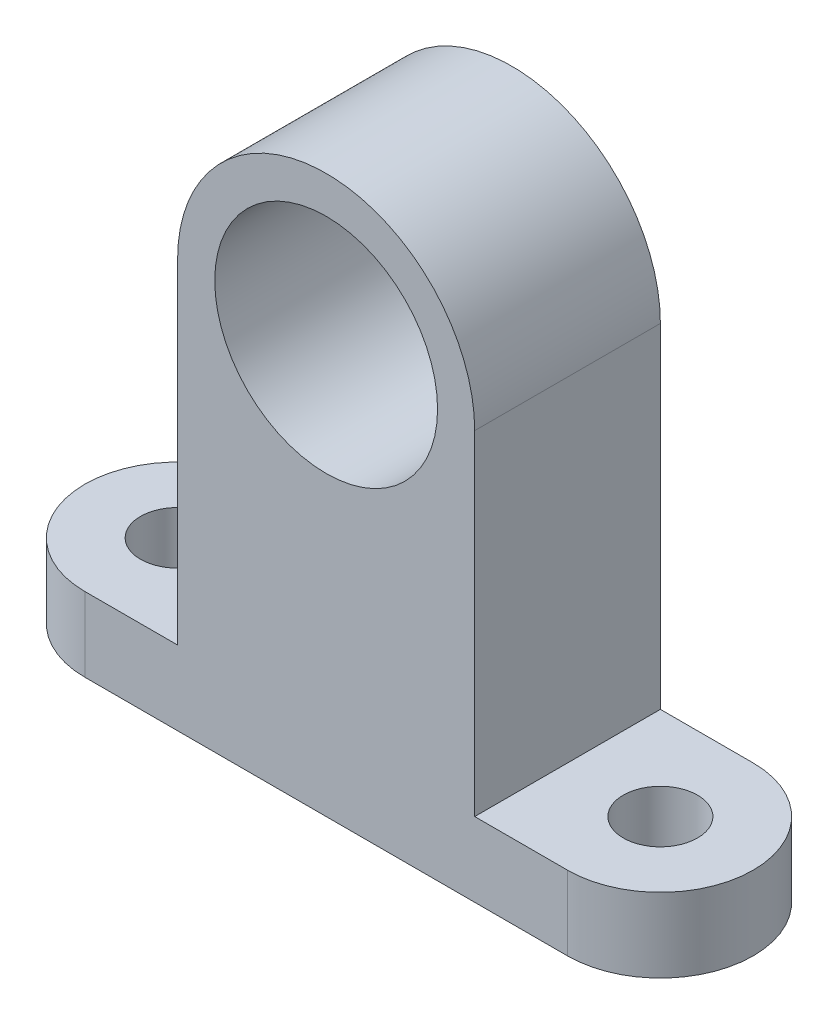
ISO-10303-21;
HEADER;
FILE_DESCRIPTION(('STEP AP214'),'2;1');
FILE_NAME('part.step','',(''),(''),'','','');
FILE_SCHEMA(('AUTOMOTIVE_DESIGN { 1 0 10303 214 1 1 1 1 }'));
ENDSEC;
DATA;
#1=APPLICATION_CONTEXT('core data for automotive mechanical design processes');
#2=APPLICATION_PROTOCOL_DEFINITION('international standard','automotive_design',2000,#1);
#3=PRODUCT_CONTEXT('',#1,'mechanical');
#4=PRODUCT('Part','Part','',(#3));
#5=PRODUCT_RELATED_PRODUCT_CATEGORY('part','',(#4));
#6=PRODUCT_DEFINITION_FORMATION('','',#4);
#7=PRODUCT_DEFINITION_CONTEXT('part definition',#1,'design');
#8=PRODUCT_DEFINITION('design','',#6,#7);
#9=PRODUCT_DEFINITION_SHAPE('','',#8);
#10=(LENGTH_UNIT() NAMED_UNIT(*) SI_UNIT(.MILLI.,.METRE.));
#11=(NAMED_UNIT(*) PLANE_ANGLE_UNIT() SI_UNIT($,.RADIAN.));
#12=(NAMED_UNIT(*) SI_UNIT($,.STERADIAN.) SOLID_ANGLE_UNIT());
#13=UNCERTAINTY_MEASURE_WITH_UNIT(LENGTH_MEASURE(1.E-05),#10,'distance_accuracy_value','');
#14=(GEOMETRIC_REPRESENTATION_CONTEXT(3) GLOBAL_UNCERTAINTY_ASSIGNED_CONTEXT((#13)) GLOBAL_UNIT_ASSIGNED_CONTEXT((#10,
#11,#12)) REPRESENTATION_CONTEXT('',''));
#15=CARTESIAN_POINT('',(0.,0.,0.));
#16=DIRECTION('',(0.,0.,1.));
#17=DIRECTION('',(1.,0.,0.));
#18=AXIS2_PLACEMENT_3D('',#15,#16,#17);
#19=CARTESIAN_POINT('',(0.,0.,127.));
#20=DIRECTION('',(0.,0.,1.));
#21=DIRECTION('',(1.,0.,0.));
#22=AXIS2_PLACEMENT_3D('',#19,#20,#21);
#23=PLANE('',#22);
#24=CARTESIAN_POINT('',(0.,0.,127.));
#25=DIRECTION('',(0.,0.,1.));
#26=DIRECTION('',(1.,0.,0.));
#27=AXIS2_PLACEMENT_3D('',#24,#25,#26);
#28=CIRCLE('',#27,203.2);
#29=CARTESIAN_POINT('',(203.2,0.,127.));
#30=VERTEX_POINT('',#29);
#31=CARTESIAN_POINT('',(-203.2,0.,127.));
#32=VERTEX_POINT('',#31);
#33=EDGE_CURVE('E162',#30,#32,#28,.T.);
#34=ORIENTED_EDGE('',*,*,#33,.T.);
#35=DIRECTION('',(0.,-1.,0.));
#36=VECTOR('',#35,1.);
#37=CARTESIAN_POINT('',(-203.2,0.,127.));
#38=LINE('',#37,#36);
#39=CARTESIAN_POINT('',(-203.2,-457.2,127.));
#40=VERTEX_POINT('',#39);
#41=EDGE_CURVE('E78',#32,#40,#38,.T.);
#42=ORIENTED_EDGE('',*,*,#41,.T.);
#43=DIRECTION('',(-1.,0.,0.));
#44=VECTOR('',#43,1.);
#45=CARTESIAN_POINT('',(-330.2,-457.2,127.));
#46=LINE('',#45,#44);
#47=CARTESIAN_POINT('',(-330.2,-457.2,127.));
#48=VERTEX_POINT('',#47);
#49=EDGE_CURVE('E124',#40,#48,#46,.T.);
#50=ORIENTED_EDGE('',*,*,#49,.T.);
#51=DIRECTION('',(0.,1.,0.));
#52=VECTOR('',#51,1.);
#53=CARTESIAN_POINT('',(-330.2,-558.8,127.));
#54=LINE('',#53,#52);
#55=CARTESIAN_POINT('',(-330.2,-558.8,127.));
#56=VERTEX_POINT('',#55);
#57=EDGE_CURVE('E121',#56,#48,#54,.T.);
#58=ORIENTED_EDGE('',*,*,#57,.F.);
#59=DIRECTION('',(-1.,0.,0.));
#60=VECTOR('',#59,1.);
#61=CARTESIAN_POINT('',(203.2,-558.8,127.));
#62=LINE('',#61,#60);
#63=CARTESIAN_POINT('',(330.2,-558.8,127.));
#64=VERTEX_POINT('',#63);
#65=EDGE_CURVE('E107',#64,#56,#62,.T.);
#66=ORIENTED_EDGE('',*,*,#65,.F.);
#67=DIRECTION('',(0.,1.,0.));
#68=VECTOR('',#67,1.);
#69=CARTESIAN_POINT('',(330.2,-558.8,127.));
#70=LINE('',#69,#68);
#71=CARTESIAN_POINT('',(330.2,-457.2,127.));
#72=VERTEX_POINT('',#71);
#73=EDGE_CURVE('E140',#64,#72,#70,.T.);
#74=ORIENTED_EDGE('',*,*,#73,.T.);
#75=CARTESIAN_POINT('',(203.2,-457.2,127.));
#76=VERTEX_POINT('',#75);
#77=EDGE_CURVE('E141',#72,#76,#46,.T.);
#78=ORIENTED_EDGE('',*,*,#77,.T.);
#79=DIRECTION('',(0.,1.,0.));
#80=VECTOR('',#79,1.);
#81=CARTESIAN_POINT('',(203.2,0.,127.));
#82=LINE('',#81,#80);
#83=EDGE_CURVE('E54',#76,#30,#82,.T.);
#84=ORIENTED_EDGE('',*,*,#83,.T.);
#85=EDGE_LOOP('',(#34,#42,#50,#58,#66,#74,#78,#84));
#86=FACE_BOUND('',#85,.T.);
#87=CARTESIAN_POINT('',(0.,0.,127.));
#88=DIRECTION('',(0.,0.,1.));
#89=DIRECTION('',(1.,0.,0.));
#90=AXIS2_PLACEMENT_3D('',#87,#88,#89);
#91=CIRCLE('',#90,152.4);
#92=CARTESIAN_POINT('',(152.4,0.,127.));
#93=VERTEX_POINT('',#92);
#94=EDGE_CURVE('E156',#93,#93,#91,.T.);
#95=ORIENTED_EDGE('',*,*,#94,.F.);
#96=EDGE_LOOP('',(#95));
#97=FACE_BOUND('',#96,.T.);
#98=ADVANCED_FACE('F37',(#86,#97),#23,.T.);
#99=CARTESIAN_POINT('',(0.,0.,-127.));
#100=DIRECTION('',(0.,0.,1.));
#101=DIRECTION('',(1.,0.,0.));
#102=AXIS2_PLACEMENT_3D('',#99,#100,#101);
#103=PLANE('',#102);
#104=CARTESIAN_POINT('',(0.,0.,-127.));
#105=DIRECTION('',(0.,0.,1.));
#106=DIRECTION('',(1.,0.,0.));
#107=AXIS2_PLACEMENT_3D('',#104,#105,#106);
#108=CIRCLE('',#107,203.2);
#109=CARTESIAN_POINT('',(203.2,0.,-127.));
#110=VERTEX_POINT('',#109);
#111=CARTESIAN_POINT('',(-203.2,0.,-127.));
#112=VERTEX_POINT('',#111);
#113=EDGE_CURVE('E159',#110,#112,#108,.T.);
#114=ORIENTED_EDGE('',*,*,#113,.F.);
#115=DIRECTION('',(0.,1.,0.));
#116=VECTOR('',#115,1.);
#117=CARTESIAN_POINT('',(203.2,0.,-127.));
#118=LINE('',#117,#116);
#119=CARTESIAN_POINT('',(203.2,-457.2,-127.));
#120=VERTEX_POINT('',#119);
#121=EDGE_CURVE('E71',#120,#110,#118,.T.);
#122=ORIENTED_EDGE('',*,*,#121,.F.);
#123=DIRECTION('',(1.,0.,0.));
#124=VECTOR('',#123,1.);
#125=CARTESIAN_POINT('',(203.2,-457.2,-127.));
#126=LINE('',#125,#124);
#127=CARTESIAN_POINT('',(330.2,-457.2,-127.));
#128=VERTEX_POINT('',#127);
#129=EDGE_CURVE('E145',#120,#128,#126,.T.);
#130=ORIENTED_EDGE('',*,*,#129,.T.);
#131=DIRECTION('',(0.,1.,0.));
#132=VECTOR('',#131,1.);
#133=CARTESIAN_POINT('',(330.2,-558.8,-127.));
#134=LINE('',#133,#132);
#135=CARTESIAN_POINT('',(330.2,-558.8,-127.));
#136=VERTEX_POINT('',#135);
#137=EDGE_CURVE('E152',#136,#128,#134,.T.);
#138=ORIENTED_EDGE('',*,*,#137,.F.);
#139=DIRECTION('',(1.,0.,0.));
#140=VECTOR('',#139,1.);
#141=CARTESIAN_POINT('',(-330.2,-558.8,-127.));
#142=LINE('',#141,#140);
#143=CARTESIAN_POINT('',(-330.2,-558.8,-127.));
#144=VERTEX_POINT('',#143);
#145=EDGE_CURVE('E134',#144,#136,#142,.T.);
#146=ORIENTED_EDGE('',*,*,#145,.F.);
#147=DIRECTION('',(0.,1.,0.));
#148=VECTOR('',#147,1.);
#149=CARTESIAN_POINT('',(-330.2,-558.8,-127.));
#150=LINE('',#149,#148);
#151=CARTESIAN_POINT('',(-330.2,-457.2,-127.));
#152=VERTEX_POINT('',#151);
#153=EDGE_CURVE('E129',#144,#152,#150,.T.);
#154=ORIENTED_EDGE('',*,*,#153,.T.);
#155=CARTESIAN_POINT('',(-203.2,-457.2,-127.));
#156=VERTEX_POINT('',#155);
#157=EDGE_CURVE('E146',#152,#156,#126,.T.);
#158=ORIENTED_EDGE('',*,*,#157,.T.);
#159=DIRECTION('',(0.,-1.,0.));
#160=VECTOR('',#159,1.);
#161=CARTESIAN_POINT('',(-203.2,0.,-127.));
#162=LINE('',#161,#160);
#163=EDGE_CURVE('E169',#112,#156,#162,.T.);
#164=ORIENTED_EDGE('',*,*,#163,.F.);
#165=EDGE_LOOP('',(#114,#122,#130,#138,#146,#154,#158,#164));
#166=FACE_BOUND('',#165,.T.);
#167=CARTESIAN_POINT('',(0.,0.,-127.));
#168=DIRECTION('',(0.,0.,1.));
#169=DIRECTION('',(1.,0.,0.));
#170=AXIS2_PLACEMENT_3D('',#167,#168,#169);
#171=CIRCLE('',#170,152.4);
#172=CARTESIAN_POINT('',(152.4,0.,-127.));
#173=VERTEX_POINT('',#172);
#174=EDGE_CURVE('E128',#173,#173,#171,.T.);
#175=ORIENTED_EDGE('',*,*,#174,.T.);
#176=EDGE_LOOP('',(#175));
#177=FACE_BOUND('',#176,.T.);
#178=ADVANCED_FACE('F178',(#166,#177),#103,.F.);
#179=CARTESIAN_POINT('',(0.,0.,127.));
#180=DIRECTION('',(0.,0.,-1.));
#181=DIRECTION('',(-1.,0.,0.));
#182=AXIS2_PLACEMENT_3D('',#179,#180,#181);
#183=CYLINDRICAL_SURFACE('',#182,203.2);
#184=ORIENTED_EDGE('',*,*,#113,.T.);
#185=DIRECTION('',(0.,0.,-1.));
#186=VECTOR('',#185,1.);
#187=CARTESIAN_POINT('',(-203.2,0.,127.));
#188=LINE('',#187,#186);
#189=EDGE_CURVE('E11',#32,#112,#188,.T.);
#190=ORIENTED_EDGE('',*,*,#189,.F.);
#191=ORIENTED_EDGE('',*,*,#33,.F.);
#192=DIRECTION('',(0.,0.,-1.));
#193=VECTOR('',#192,1.);
#194=CARTESIAN_POINT('',(203.2,0.,127.));
#195=LINE('',#194,#193);
#196=EDGE_CURVE('E166',#30,#110,#195,.T.);
#197=ORIENTED_EDGE('',*,*,#196,.T.);
#198=EDGE_LOOP('',(#184,#190,#191,#197));
#199=FACE_BOUND('',#198,.T.);
#200=ADVANCED_FACE('F39',(#199),#183,.T.);
#201=CARTESIAN_POINT('',(-203.2,0.,127.));
#202=DIRECTION('',(1.,0.,0.));
#203=DIRECTION('',(0.,1.,0.));
#204=AXIS2_PLACEMENT_3D('',#201,#202,#203);
#205=PLANE('',#204);
#206=ORIENTED_EDGE('',*,*,#163,.T.);
#207=DIRECTION('',(0.,0.,-1.));
#208=VECTOR('',#207,1.);
#209=CARTESIAN_POINT('',(-203.2,-457.2,127.));
#210=LINE('',#209,#208);
#211=EDGE_CURVE('E46',#40,#156,#210,.T.);
#212=ORIENTED_EDGE('',*,*,#211,.F.);
#213=ORIENTED_EDGE('',*,*,#41,.F.);
#214=ORIENTED_EDGE('',*,*,#189,.T.);
#215=EDGE_LOOP('',(#206,#212,#213,#214));
#216=FACE_BOUND('',#215,.T.);
#217=ADVANCED_FACE('F231',(#216),#205,.F.);
#218=CARTESIAN_POINT('',(203.2,0.,127.));
#219=DIRECTION('',(-1.,0.,0.));
#220=DIRECTION('',(0.,-1.,0.));
#221=AXIS2_PLACEMENT_3D('',#218,#219,#220);
#222=PLANE('',#221);
#223=ORIENTED_EDGE('',*,*,#121,.T.);
#224=ORIENTED_EDGE('',*,*,#196,.F.);
#225=ORIENTED_EDGE('',*,*,#83,.F.);
#226=DIRECTION('',(0.,0.,-1.));
#227=VECTOR('',#226,1.);
#228=CARTESIAN_POINT('',(203.2,-457.2,127.));
#229=LINE('',#228,#227);
#230=EDGE_CURVE('E68',#76,#120,#229,.T.);
#231=ORIENTED_EDGE('',*,*,#230,.T.);
#232=EDGE_LOOP('',(#223,#224,#225,#231));
#233=FACE_BOUND('',#232,.T.);
#234=ADVANCED_FACE('F229',(#233),#222,.F.);
#235=CARTESIAN_POINT('',(0.,0.,127.));
#236=DIRECTION('',(0.,0.,-1.));
#237=DIRECTION('',(-1.,0.,0.));
#238=AXIS2_PLACEMENT_3D('',#235,#236,#237);
#239=CYLINDRICAL_SURFACE('',#238,152.4);
#240=ORIENTED_EDGE('',*,*,#94,.T.);
#241=EDGE_LOOP('',(#240));
#242=FACE_BOUND('',#241,.T.);
#243=ORIENTED_EDGE('',*,*,#174,.F.);
#244=EDGE_LOOP('',(#243));
#245=FACE_BOUND('',#244,.T.);
#246=ADVANCED_FACE('F226',(#242,#245),#239,.F.);
#247=CARTESIAN_POINT('',(330.2,-457.2,0.));
#248=DIRECTION('',(0.,-1.,0.));
#249=DIRECTION('',(1.,0.,0.));
#250=AXIS2_PLACEMENT_3D('',#247,#248,#249);
#251=PLANE('',#250);
#252=CARTESIAN_POINT('',(-330.2,-457.2,0.));
#253=DIRECTION('',(0.,-1.,0.));
#254=DIRECTION('',(1.,0.,0.));
#255=AXIS2_PLACEMENT_3D('',#252,#253,#254);
#256=CIRCLE('',#255,50.8);
#257=CARTESIAN_POINT('',(-279.4,-457.2,0.));
#258=VERTEX_POINT('',#257);
#259=EDGE_CURVE('E197',#258,#258,#256,.T.);
#260=ORIENTED_EDGE('',*,*,#259,.T.);
#261=EDGE_LOOP('',(#260));
#262=FACE_BOUND('',#261,.T.);
#263=ORIENTED_EDGE('',*,*,#49,.F.);
#264=ORIENTED_EDGE('',*,*,#211,.T.);
#265=ORIENTED_EDGE('',*,*,#157,.F.);
#266=CARTESIAN_POINT('',(-330.2,-457.2,0.));
#267=DIRECTION('',(0.,-1.,0.));
#268=DIRECTION('',(1.,0.,0.));
#269=AXIS2_PLACEMENT_3D('',#266,#267,#268);
#270=CIRCLE('',#269,127.);
#271=EDGE_CURVE('E143',#48,#152,#270,.T.);
#272=ORIENTED_EDGE('',*,*,#271,.F.);
#273=EDGE_LOOP('',(#263,#264,#265,#272));
#274=FACE_BOUND('',#273,.T.);
#275=ADVANCED_FACE('F175',(#262,#274),#251,.F.);
#276=CARTESIAN_POINT('',(330.2,-558.8,0.));
#277=DIRECTION('',(0.,-1.,0.));
#278=DIRECTION('',(1.,0.,0.));
#279=AXIS2_PLACEMENT_3D('',#276,#277,#278);
#280=PLANE('',#279);
#281=CARTESIAN_POINT('',(-330.2,-558.8,0.));
#282=DIRECTION('',(0.,-1.,0.));
#283=DIRECTION('',(1.,0.,0.));
#284=AXIS2_PLACEMENT_3D('',#281,#282,#283);
#285=CIRCLE('',#284,50.8);
#286=CARTESIAN_POINT('',(-279.4,-558.8,0.));
#287=VERTEX_POINT('',#286);
#288=EDGE_CURVE('E200',#287,#287,#285,.T.);
#289=ORIENTED_EDGE('',*,*,#288,.F.);
#290=EDGE_LOOP('',(#289));
#291=FACE_BOUND('',#290,.T.);
#292=ORIENTED_EDGE('',*,*,#65,.T.);
#293=CARTESIAN_POINT('',(-330.2,-558.8,0.));
#294=DIRECTION('',(0.,-1.,0.));
#295=DIRECTION('',(1.,0.,0.));
#296=AXIS2_PLACEMENT_3D('',#293,#294,#295);
#297=CIRCLE('',#296,127.);
#298=EDGE_CURVE('E112',#56,#144,#297,.T.);
#299=ORIENTED_EDGE('',*,*,#298,.T.);
#300=ORIENTED_EDGE('',*,*,#145,.T.);
#301=CARTESIAN_POINT('',(330.2,-558.8,0.));
#302=DIRECTION('',(0.,-1.,0.));
#303=DIRECTION('',(1.,0.,0.));
#304=AXIS2_PLACEMENT_3D('',#301,#302,#303);
#305=CIRCLE('',#304,127.);
#306=EDGE_CURVE('E115',#136,#64,#305,.T.);
#307=ORIENTED_EDGE('',*,*,#306,.T.);
#308=EDGE_LOOP('',(#292,#299,#300,#307));
#309=FACE_BOUND('',#308,.T.);
#310=CARTESIAN_POINT('',(330.2,-558.8,0.));
#311=DIRECTION('',(0.,-1.,0.));
#312=DIRECTION('',(1.,0.,0.));
#313=AXIS2_PLACEMENT_3D('',#310,#311,#312);
#314=CIRCLE('',#313,50.8);
#315=CARTESIAN_POINT('',(381.,-558.8,0.));
#316=VERTEX_POINT('',#315);
#317=EDGE_CURVE('E194',#316,#316,#314,.T.);
#318=ORIENTED_EDGE('',*,*,#317,.F.);
#319=EDGE_LOOP('',(#318));
#320=FACE_BOUND('',#319,.T.);
#321=ADVANCED_FACE('F109',(#291,#309,#320),#280,.T.);
#322=ORIENTED_EDGE('',*,*,#230,.F.);
#323=ORIENTED_EDGE('',*,*,#77,.F.);
#324=CARTESIAN_POINT('',(330.2,-457.2,0.));
#325=DIRECTION('',(0.,-1.,0.));
#326=DIRECTION('',(1.,0.,0.));
#327=AXIS2_PLACEMENT_3D('',#324,#325,#326);
#328=CIRCLE('',#327,127.);
#329=EDGE_CURVE('E118',#128,#72,#328,.T.);
#330=ORIENTED_EDGE('',*,*,#329,.F.);
#331=ORIENTED_EDGE('',*,*,#129,.F.);
#332=EDGE_LOOP('',(#322,#323,#330,#331));
#333=FACE_BOUND('',#332,.T.);
#334=CARTESIAN_POINT('',(330.2,-457.2,0.));
#335=DIRECTION('',(0.,-1.,0.));
#336=DIRECTION('',(1.,0.,0.));
#337=AXIS2_PLACEMENT_3D('',#334,#335,#336);
#338=CIRCLE('',#337,50.8);
#339=CARTESIAN_POINT('',(381.,-457.2,0.));
#340=VERTEX_POINT('',#339);
#341=EDGE_CURVE('E192',#340,#340,#338,.T.);
#342=ORIENTED_EDGE('',*,*,#341,.T.);
#343=EDGE_LOOP('',(#342));
#344=FACE_BOUND('',#343,.T.);
#345=ADVANCED_FACE('F186',(#333,#344),#251,.F.);
#346=CARTESIAN_POINT('',(-330.2,-558.8,0.));
#347=DIRECTION('',(0.,1.,0.));
#348=DIRECTION('',(-1.,0.,0.));
#349=AXIS2_PLACEMENT_3D('',#346,#347,#348);
#350=CYLINDRICAL_SURFACE('',#349,127.);
#351=ORIENTED_EDGE('',*,*,#271,.T.);
#352=ORIENTED_EDGE('',*,*,#153,.F.);
#353=ORIENTED_EDGE('',*,*,#298,.F.);
#354=ORIENTED_EDGE('',*,*,#57,.T.);
#355=EDGE_LOOP('',(#351,#352,#353,#354));
#356=FACE_BOUND('',#355,.T.);
#357=ADVANCED_FACE('F131',(#356),#350,.T.);
#358=CARTESIAN_POINT('',(330.2,-558.8,0.));
#359=DIRECTION('',(0.,1.,0.));
#360=DIRECTION('',(-1.,0.,0.));
#361=AXIS2_PLACEMENT_3D('',#358,#359,#360);
#362=CYLINDRICAL_SURFACE('',#361,127.);
#363=ORIENTED_EDGE('',*,*,#329,.T.);
#364=ORIENTED_EDGE('',*,*,#73,.F.);
#365=ORIENTED_EDGE('',*,*,#306,.F.);
#366=ORIENTED_EDGE('',*,*,#137,.T.);
#367=EDGE_LOOP('',(#363,#364,#365,#366));
#368=FACE_BOUND('',#367,.T.);
#369=ADVANCED_FACE('F184',(#368),#362,.T.);
#370=CARTESIAN_POINT('',(-330.2,-558.8,0.));
#371=DIRECTION('',(0.,1.,0.));
#372=DIRECTION('',(-1.,0.,0.));
#373=AXIS2_PLACEMENT_3D('',#370,#371,#372);
#374=CYLINDRICAL_SURFACE('',#373,50.8);
#375=ORIENTED_EDGE('',*,*,#288,.T.);
#376=EDGE_LOOP('',(#375));
#377=FACE_BOUND('',#376,.T.);
#378=ORIENTED_EDGE('',*,*,#259,.F.);
#379=EDGE_LOOP('',(#378));
#380=FACE_BOUND('',#379,.T.);
#381=ADVANCED_FACE('F206',(#377,#380),#374,.F.);
#382=CARTESIAN_POINT('',(330.2,-558.8,0.));
#383=DIRECTION('',(0.,1.,0.));
#384=DIRECTION('',(-1.,0.,0.));
#385=AXIS2_PLACEMENT_3D('',#382,#383,#384);
#386=CYLINDRICAL_SURFACE('',#385,50.8);
#387=ORIENTED_EDGE('',*,*,#317,.T.);
#388=EDGE_LOOP('',(#387));
#389=FACE_BOUND('',#388,.T.);
#390=ORIENTED_EDGE('',*,*,#341,.F.);
#391=EDGE_LOOP('',(#390));
#392=FACE_BOUND('',#391,.T.);
#393=ADVANCED_FACE('F208',(#389,#392),#386,.F.);
#394=CLOSED_SHELL('',(#98,#178,#200,#217,#234,#246,#275,#321,#345,#357,#369,#381,#393));
#395=MANIFOLD_SOLID_BREP('B2',#394);
#396=ADVANCED_BREP_SHAPE_REPRESENTATION('',(#18,#395),#14);
#397=SHAPE_DEFINITION_REPRESENTATION(#9,#396);
ENDSEC;
END-ISO-10303-21;
